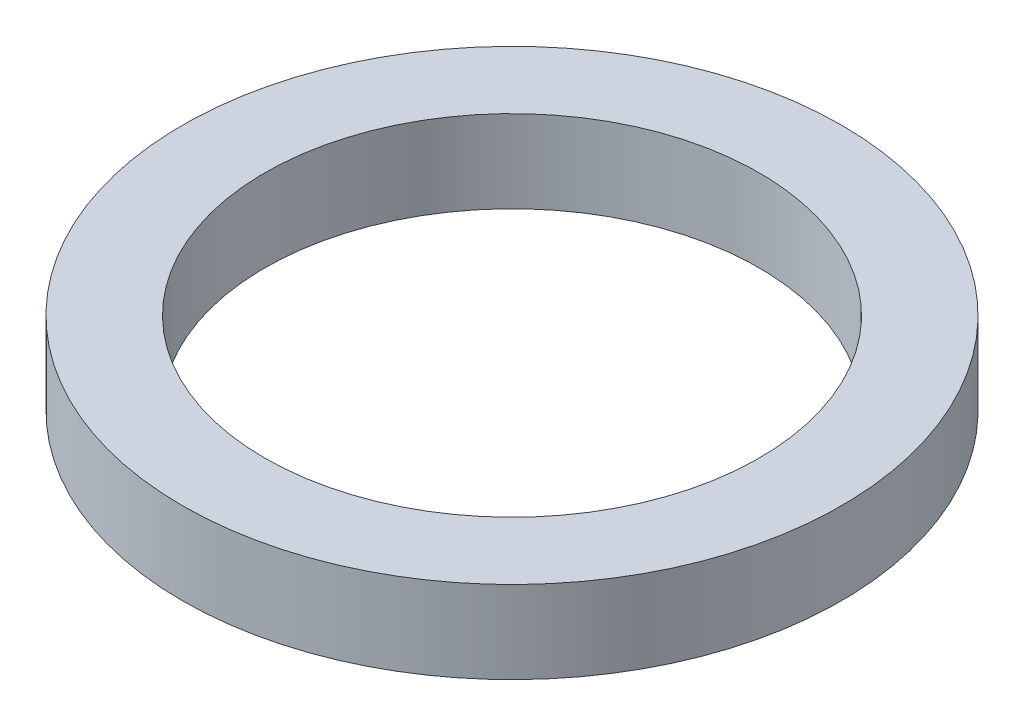
ISO-10303-21;
HEADER;
FILE_DESCRIPTION(('STEP AP214'),'2;1');
FILE_NAME('part.step','',(''),(''),'','','');
FILE_SCHEMA(('AUTOMOTIVE_DESIGN { 1 0 10303 214 1 1 1 1 }'));
ENDSEC;
DATA;
#1=APPLICATION_CONTEXT('core data for automotive mechanical design processes');
#2=APPLICATION_PROTOCOL_DEFINITION('international standard','automotive_design',2000,#1);
#3=PRODUCT_CONTEXT('',#1,'mechanical');
#4=PRODUCT('Part','Part','',(#3));
#5=PRODUCT_RELATED_PRODUCT_CATEGORY('part','',(#4));
#6=PRODUCT_DEFINITION_FORMATION('','',#4);
#7=PRODUCT_DEFINITION_CONTEXT('part definition',#1,'design');
#8=PRODUCT_DEFINITION('design','',#6,#7);
#9=PRODUCT_DEFINITION_SHAPE('','',#8);
#10=(LENGTH_UNIT() NAMED_UNIT(*) SI_UNIT(.MILLI.,.METRE.));
#11=(NAMED_UNIT(*) PLANE_ANGLE_UNIT() SI_UNIT($,.RADIAN.));
#12=(NAMED_UNIT(*) SI_UNIT($,.STERADIAN.) SOLID_ANGLE_UNIT());
#13=UNCERTAINTY_MEASURE_WITH_UNIT(LENGTH_MEASURE(1.E-05),#10,'distance_accuracy_value','');
#14=(GEOMETRIC_REPRESENTATION_CONTEXT(3) GLOBAL_UNCERTAINTY_ASSIGNED_CONTEXT((#13)) GLOBAL_UNIT_ASSIGNED_CONTEXT((#10,
#11,#12)) REPRESENTATION_CONTEXT('',''));
#15=CARTESIAN_POINT('',(0.,0.,0.));
#16=DIRECTION('',(0.,0.,1.));
#17=DIRECTION('',(1.,0.,0.));
#18=AXIS2_PLACEMENT_3D('',#15,#16,#17);
#19=CARTESIAN_POINT('',(0.,1.,0.));
#20=DIRECTION('',(0.,1.,0.));
#21=DIRECTION('',(0.,0.,1.));
#22=AXIS2_PLACEMENT_3D('',#19,#20,#21);
#23=PLANE('',#22);
#24=CARTESIAN_POINT('',(0.,1.,0.));
#25=DIRECTION('',(0.,1.,0.));
#26=DIRECTION('',(0.,0.,1.));
#27=AXIS2_PLACEMENT_3D('',#24,#25,#26);
#28=CIRCLE('',#27,4.);
#29=CARTESIAN_POINT('',(0.,1.,4.));
#30=VERTEX_POINT('',#29);
#31=EDGE_CURVE('E10',#30,#30,#28,.T.);
#32=ORIENTED_EDGE('',*,*,#31,.T.);
#33=EDGE_LOOP('',(#32));
#34=FACE_BOUND('',#33,.T.);
#35=CARTESIAN_POINT('',(0.,1.,0.));
#36=DIRECTION('',(0.,1.,0.));
#37=DIRECTION('',(0.,0.,1.));
#38=AXIS2_PLACEMENT_3D('',#35,#36,#37);
#39=CIRCLE('',#38,3.);
#40=CARTESIAN_POINT('',(0.,1.,3.));
#41=VERTEX_POINT('',#40);
#42=EDGE_CURVE('E56',#41,#41,#39,.T.);
#43=ORIENTED_EDGE('',*,*,#42,.F.);
#44=EDGE_LOOP('',(#43));
#45=FACE_BOUND('',#44,.T.);
#46=ADVANCED_FACE('F43',(#34,#45),#23,.T.);
#47=CARTESIAN_POINT('',(0.,0.,0.));
#48=DIRECTION('',(0.,1.,0.));
#49=DIRECTION('',(0.,0.,1.));
#50=AXIS2_PLACEMENT_3D('',#47,#48,#49);
#51=PLANE('',#50);
#52=CARTESIAN_POINT('',(0.,0.,0.));
#53=DIRECTION('',(0.,1.,0.));
#54=DIRECTION('',(0.,0.,1.));
#55=AXIS2_PLACEMENT_3D('',#52,#53,#54);
#56=CIRCLE('',#55,4.);
#57=CARTESIAN_POINT('',(0.,0.,4.));
#58=VERTEX_POINT('',#57);
#59=EDGE_CURVE('E47',#58,#58,#56,.T.);
#60=ORIENTED_EDGE('',*,*,#59,.F.);
#61=EDGE_LOOP('',(#60));
#62=FACE_BOUND('',#61,.T.);
#63=CARTESIAN_POINT('',(0.,0.,0.));
#64=DIRECTION('',(0.,1.,0.));
#65=DIRECTION('',(0.,0.,1.));
#66=AXIS2_PLACEMENT_3D('',#63,#64,#65);
#67=CIRCLE('',#66,3.);
#68=CARTESIAN_POINT('',(0.,0.,3.));
#69=VERTEX_POINT('',#68);
#70=EDGE_CURVE('E58',#69,#69,#67,.T.);
#71=ORIENTED_EDGE('',*,*,#70,.T.);
#72=EDGE_LOOP('',(#71));
#73=FACE_BOUND('',#72,.T.);
#74=ADVANCED_FACE('F70',(#62,#73),#51,.F.);
#75=CARTESIAN_POINT('',(0.,1.,0.));
#76=DIRECTION('',(0.,-1.,0.));
#77=DIRECTION('',(0.,0.,-1.));
#78=AXIS2_PLACEMENT_3D('',#75,#76,#77);
#79=CYLINDRICAL_SURFACE('',#78,4.);
#80=ORIENTED_EDGE('',*,*,#31,.F.);
#81=EDGE_LOOP('',(#80));
#82=FACE_BOUND('',#81,.T.);
#83=ORIENTED_EDGE('',*,*,#59,.T.);
#84=EDGE_LOOP('',(#83));
#85=FACE_BOUND('',#84,.T.);
#86=ADVANCED_FACE('F45',(#82,#85),#79,.T.);
#87=CARTESIAN_POINT('',(0.,1.,0.));
#88=DIRECTION('',(0.,-1.,0.));
#89=DIRECTION('',(0.,0.,-1.));
#90=AXIS2_PLACEMENT_3D('',#87,#88,#89);
#91=CYLINDRICAL_SURFACE('',#90,3.);
#92=ORIENTED_EDGE('',*,*,#42,.T.);
#93=EDGE_LOOP('',(#92));
#94=FACE_BOUND('',#93,.T.);
#95=ORIENTED_EDGE('',*,*,#70,.F.);
#96=EDGE_LOOP('',(#95));
#97=FACE_BOUND('',#96,.T.);
#98=ADVANCED_FACE('F66',(#94,#97),#91,.F.);
#99=CLOSED_SHELL('',(#46,#74,#86,#98));
#100=MANIFOLD_SOLID_BREP('B2',#99);
#101=ADVANCED_BREP_SHAPE_REPRESENTATION('',(#18,#100),#14);
#102=SHAPE_DEFINITION_REPRESENTATION(#9,#101);
ENDSEC;
END-ISO-10303-21;
